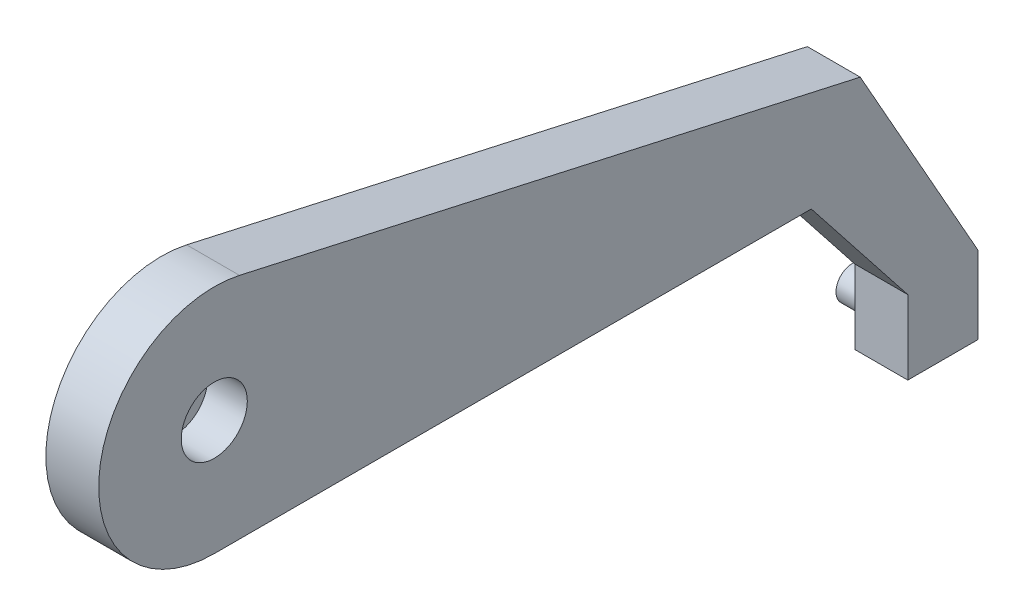
ISO-10303-21;
HEADER;
FILE_DESCRIPTION(('STEP AP214'),'2;1');
FILE_NAME('part.step','',(''),(''),'','','');
FILE_SCHEMA(('AUTOMOTIVE_DESIGN { 1 0 10303 214 1 1 1 1 }'));
ENDSEC;
DATA;
#1=APPLICATION_CONTEXT('core data for automotive mechanical design processes');
#2=APPLICATION_PROTOCOL_DEFINITION('international standard','automotive_design',2000,#1);
#3=PRODUCT_CONTEXT('',#1,'mechanical');
#4=PRODUCT('Part','Part','',(#3));
#5=PRODUCT_RELATED_PRODUCT_CATEGORY('part','',(#4));
#6=PRODUCT_DEFINITION_FORMATION('','',#4);
#7=PRODUCT_DEFINITION_CONTEXT('part definition',#1,'design');
#8=PRODUCT_DEFINITION('design','',#6,#7);
#9=PRODUCT_DEFINITION_SHAPE('','',#8);
#10=(LENGTH_UNIT() NAMED_UNIT(*) SI_UNIT(.MILLI.,.METRE.));
#11=(NAMED_UNIT(*) PLANE_ANGLE_UNIT() SI_UNIT($,.RADIAN.));
#12=(NAMED_UNIT(*) SI_UNIT($,.STERADIAN.) SOLID_ANGLE_UNIT());
#13=UNCERTAINTY_MEASURE_WITH_UNIT(LENGTH_MEASURE(1.E-05),#10,'distance_accuracy_value','');
#14=(GEOMETRIC_REPRESENTATION_CONTEXT(3) GLOBAL_UNCERTAINTY_ASSIGNED_CONTEXT((#13)) GLOBAL_UNIT_ASSIGNED_CONTEXT((#10,
#11,#12)) REPRESENTATION_CONTEXT('',''));
#15=CARTESIAN_POINT('',(0.,0.,0.));
#16=DIRECTION('',(0.,0.,1.));
#17=DIRECTION('',(1.,0.,0.));
#18=AXIS2_PLACEMENT_3D('',#15,#16,#17);
#19=CARTESIAN_POINT('',(80.,148.730177318233,-1282.73975809822));
#20=DIRECTION('',(-1.,0.,0.));
#21=DIRECTION('',(0.,0.,1.));
#22=AXIS2_PLACEMENT_3D('',#19,#20,#21);
#23=CYLINDRICAL_SURFACE('',#22,175.);
#24=CARTESIAN_POINT('',(0.,148.730177318233,-1282.73975809822));
#25=DIRECTION('',(1.,0.,0.));
#26=DIRECTION('',(0.,0.,-1.));
#27=AXIS2_PLACEMENT_3D('',#24,#25,#26);
#28=CIRCLE('',#27,175.);
#29=CARTESIAN_POINT('',(0.,319.519232733245,-1320.8986174948));
#30=VERTEX_POINT('',#29);
#31=CARTESIAN_POINT('',(0.,-26.2698226817672,-1282.73975809822));
#32=VERTEX_POINT('',#31);
#33=EDGE_CURVE('E147',#30,#32,#28,.T.);
#34=ORIENTED_EDGE('',*,*,#33,.T.);
#35=DIRECTION('',(-1.,0.,0.));
#36=VECTOR('',#35,1.);
#37=CARTESIAN_POINT('',(80.,-26.2698226817672,-1282.73975809822));
#38=LINE('',#37,#36);
#39=CARTESIAN_POINT('',(80.,-26.2698226817672,-1282.73975809822));
#40=VERTEX_POINT('',#39);
#41=EDGE_CURVE('E54',#40,#32,#38,.T.);
#42=ORIENTED_EDGE('',*,*,#41,.F.);
#43=CARTESIAN_POINT('',(80.,148.730177318233,-1282.73975809822));
#44=DIRECTION('',(1.,0.,0.));
#45=DIRECTION('',(0.,0.,-1.));
#46=AXIS2_PLACEMENT_3D('',#43,#44,#45);
#47=CIRCLE('',#46,175.);
#48=CARTESIAN_POINT('',(80.,319.519232733245,-1320.8986174948));
#49=VERTEX_POINT('',#48);
#50=EDGE_CURVE('E170',#49,#40,#47,.T.);
#51=ORIENTED_EDGE('',*,*,#50,.F.);
#52=DIRECTION('',(-1.,0.,0.));
#53=VECTOR('',#52,1.);
#54=CARTESIAN_POINT('',(80.,319.519232733245,-1320.8986174948));
#55=LINE('',#54,#53);
#56=EDGE_CURVE('E143',#49,#30,#55,.T.);
#57=ORIENTED_EDGE('',*,*,#56,.T.);
#58=EDGE_LOOP('',(#34,#42,#51,#57));
#59=FACE_BOUND('',#58,.T.);
#60=ADVANCED_FACE('F45',(#59),#23,.T.);
#61=CARTESIAN_POINT('',(80.,-26.2698226817672,-2186.53481553058));
#62=DIRECTION('',(0.,1.,0.));
#63=DIRECTION('',(0.,0.,1.));
#64=AXIS2_PLACEMENT_3D('',#61,#62,#63);
#65=PLANE('',#64);
#66=DIRECTION('',(0.,0.,-1.));
#67=VECTOR('',#66,1.);
#68=CARTESIAN_POINT('',(0.,-26.2698226817672,-2186.53481553058));
#69=LINE('',#68,#67);
#70=CARTESIAN_POINT('',(0.,-26.2698226817672,-2186.53481553058));
#71=VERTEX_POINT('',#70);
#72=EDGE_CURVE('E151',#32,#71,#69,.T.);
#73=ORIENTED_EDGE('',*,*,#72,.T.);
#74=DIRECTION('',(-1.,0.,0.));
#75=VECTOR('',#74,1.);
#76=CARTESIAN_POINT('',(80.,-26.2698226817672,-2186.53481553058));
#77=LINE('',#76,#75);
#78=CARTESIAN_POINT('',(80.,-26.2698226817672,-2186.53481553058));
#79=VERTEX_POINT('',#78);
#80=EDGE_CURVE('E185',#79,#71,#77,.T.);
#81=ORIENTED_EDGE('',*,*,#80,.F.);
#82=DIRECTION('',(0.,0.,-1.));
#83=VECTOR('',#82,1.);
#84=CARTESIAN_POINT('',(80.,-26.2698226817672,-2186.53481553058));
#85=LINE('',#84,#83);
#86=EDGE_CURVE('E106',#40,#79,#85,.T.);
#87=ORIENTED_EDGE('',*,*,#86,.F.);
#88=ORIENTED_EDGE('',*,*,#41,.T.);
#89=EDGE_LOOP('',(#73,#81,#87,#88));
#90=FACE_BOUND('',#89,.T.);
#91=ADVANCED_FACE('F190',(#90),#65,.F.);
#92=CARTESIAN_POINT('',(80.,-211.630732544569,-2332.6588914157));
#93=DIRECTION('',(0.,0.619086939164466,-0.785322457183018));
#94=DIRECTION('',(0.,0.785322457183018,0.619086939164466));
#95=AXIS2_PLACEMENT_3D('',#92,#93,#94);
#96=PLANE('',#95);
#97=DIRECTION('',(0.,-0.785322457183018,-0.619086939164466));
#98=VECTOR('',#97,1.);
#99=CARTESIAN_POINT('',(0.,-211.630732544569,-2332.6588914157));
#100=LINE('',#99,#98);
#101=CARTESIAN_POINT('',(0.,-211.630732544569,-2332.6588914157));
#102=VERTEX_POINT('',#101);
#103=EDGE_CURVE('E155',#71,#102,#100,.T.);
#104=ORIENTED_EDGE('',*,*,#103,.T.);
#105=DIRECTION('',(-1.,0.,0.));
#106=VECTOR('',#105,1.);
#107=CARTESIAN_POINT('',(80.,-211.630732544569,-2332.6588914157));
#108=LINE('',#107,#106);
#109=CARTESIAN_POINT('',(80.,-211.630732544569,-2332.6588914157));
#110=VERTEX_POINT('',#109);
#111=EDGE_CURVE('E181',#110,#102,#108,.T.);
#112=ORIENTED_EDGE('',*,*,#111,.F.);
#113=DIRECTION('',(0.,-0.785322457183018,-0.619086939164466));
#114=VECTOR('',#113,1.);
#115=CARTESIAN_POINT('',(80.,-211.630732544569,-2332.6588914157));
#116=LINE('',#115,#114);
#117=EDGE_CURVE('E209',#79,#110,#116,.T.);
#118=ORIENTED_EDGE('',*,*,#117,.F.);
#119=ORIENTED_EDGE('',*,*,#80,.T.);
#120=EDGE_LOOP('',(#104,#112,#118,#119));
#121=FACE_BOUND('',#120,.T.);
#122=ADVANCED_FACE('F201',(#121),#96,.F.);
#123=CARTESIAN_POINT('',(80.,-323.730177318233,-2332.6588914157));
#124=DIRECTION('',(0.,0.,-1.));
#125=DIRECTION('',(-1.,0.,0.));
#126=AXIS2_PLACEMENT_3D('',#123,#124,#125);
#127=PLANE('',#126);
#128=DIRECTION('',(0.,-1.,0.));
#129=VECTOR('',#128,1.);
#130=CARTESIAN_POINT('',(0.,-323.730177318233,-2332.6588914157));
#131=LINE('',#130,#129);
#132=CARTESIAN_POINT('',(0.,-323.730177318233,-2332.6588914157));
#133=VERTEX_POINT('',#132);
#134=EDGE_CURVE('E158',#102,#133,#131,.T.);
#135=ORIENTED_EDGE('',*,*,#134,.T.);
#136=DIRECTION('',(-1.,0.,0.));
#137=VECTOR('',#136,1.);
#138=CARTESIAN_POINT('',(80.,-323.730177318233,-2332.6588914157));
#139=LINE('',#138,#137);
#140=CARTESIAN_POINT('',(80.,-323.730177318233,-2332.6588914157));
#141=VERTEX_POINT('',#140);
#142=EDGE_CURVE('E177',#141,#133,#139,.T.);
#143=ORIENTED_EDGE('',*,*,#142,.F.);
#144=DIRECTION('',(0.,-1.,0.));
#145=VECTOR('',#144,1.);
#146=CARTESIAN_POINT('',(80.,-323.730177318233,-2332.6588914157));
#147=LINE('',#146,#145);
#148=EDGE_CURVE('E207',#110,#141,#147,.T.);
#149=ORIENTED_EDGE('',*,*,#148,.F.);
#150=ORIENTED_EDGE('',*,*,#111,.T.);
#151=EDGE_LOOP('',(#135,#143,#149,#150));
#152=FACE_BOUND('',#151,.T.);
#153=ADVANCED_FACE('F205',(#152),#127,.F.);
#154=CARTESIAN_POINT('',(80.,-323.730177318233,-2438.9246062279));
#155=DIRECTION('',(0.,1.,0.));
#156=DIRECTION('',(0.,0.,1.));
#157=AXIS2_PLACEMENT_3D('',#154,#155,#156);
#158=PLANE('',#157);
#159=DIRECTION('',(0.,0.,-1.));
#160=VECTOR('',#159,1.);
#161=CARTESIAN_POINT('',(0.,-323.730177318233,-2438.9246062279));
#162=LINE('',#161,#160);
#163=CARTESIAN_POINT('',(0.,-323.730177318233,-2438.9246062279));
#164=VERTEX_POINT('',#163);
#165=EDGE_CURVE('E161',#133,#164,#162,.T.);
#166=ORIENTED_EDGE('',*,*,#165,.T.);
#167=DIRECTION('',(-1.,0.,0.));
#168=VECTOR('',#167,1.);
#169=CARTESIAN_POINT('',(80.,-323.730177318233,-2438.9246062279));
#170=LINE('',#169,#168);
#171=CARTESIAN_POINT('',(80.,-323.730177318233,-2438.9246062279));
#172=VERTEX_POINT('',#171);
#173=EDGE_CURVE('E136',#172,#164,#170,.T.);
#174=ORIENTED_EDGE('',*,*,#173,.F.);
#175=DIRECTION('',(0.,0.,-1.));
#176=VECTOR('',#175,1.);
#177=CARTESIAN_POINT('',(80.,-323.730177318233,-2438.9246062279));
#178=LINE('',#177,#176);
#179=EDGE_CURVE('E125',#141,#172,#178,.T.);
#180=ORIENTED_EDGE('',*,*,#179,.F.);
#181=ORIENTED_EDGE('',*,*,#142,.T.);
#182=EDGE_LOOP('',(#166,#174,#180,#181));
#183=FACE_BOUND('',#182,.T.);
#184=ADVANCED_FACE('F265',(#183),#158,.F.);
#185=CARTESIAN_POINT('',(80.,-206.48081136748,-2438.9246062279));
#186=DIRECTION('',(0.,0.,1.));
#187=DIRECTION('',(1.,0.,0.));
#188=AXIS2_PLACEMENT_3D('',#185,#186,#187);
#189=PLANE('',#188);
#190=DIRECTION('',(0.,1.,0.));
#191=VECTOR('',#190,1.);
#192=CARTESIAN_POINT('',(0.,-206.48081136748,-2438.9246062279));
#193=LINE('',#192,#191);
#194=CARTESIAN_POINT('',(0.,-206.48081136748,-2438.9246062279));
#195=VERTEX_POINT('',#194);
#196=EDGE_CURVE('E134',#164,#195,#193,.T.);
#197=ORIENTED_EDGE('',*,*,#196,.T.);
#198=DIRECTION('',(-1.,0.,0.));
#199=VECTOR('',#198,1.);
#200=CARTESIAN_POINT('',(80.,-206.48081136748,-2438.9246062279));
#201=LINE('',#200,#199);
#202=CARTESIAN_POINT('',(80.,-206.48081136748,-2438.9246062279));
#203=VERTEX_POINT('',#202);
#204=EDGE_CURVE('E131',#203,#195,#201,.T.);
#205=ORIENTED_EDGE('',*,*,#204,.F.);
#206=DIRECTION('',(0.,1.,0.));
#207=VECTOR('',#206,1.);
#208=CARTESIAN_POINT('',(80.,-206.48081136748,-2438.9246062279));
#209=LINE('',#208,#207);
#210=EDGE_CURVE('E119',#172,#203,#209,.T.);
#211=ORIENTED_EDGE('',*,*,#210,.F.);
#212=ORIENTED_EDGE('',*,*,#173,.T.);
#213=EDGE_LOOP('',(#197,#205,#211,#212));
#214=FACE_BOUND('',#213,.T.);
#215=ADVANCED_FACE('F132',(#214),#189,.F.);
#216=CARTESIAN_POINT('',(80.,109.55856474662,-2260.62754877818));
#217=DIRECTION('',(0.,-0.491359726652531,0.870956726263682));
#218=DIRECTION('',(0.,-0.870956726263682,-0.491359726652531));
#219=AXIS2_PLACEMENT_3D('',#216,#217,#218);
#220=PLANE('',#219);
#221=DIRECTION('',(0.,0.870956726263682,0.491359726652531));
#222=VECTOR('',#221,1.);
#223=CARTESIAN_POINT('',(0.,109.55856474662,-2260.62754877818));
#224=LINE('',#223,#222);
#225=CARTESIAN_POINT('',(0.,109.55856474662,-2260.62754877818));
#226=VERTEX_POINT('',#225);
#227=EDGE_CURVE('E91',#195,#226,#224,.T.);
#228=ORIENTED_EDGE('',*,*,#227,.T.);
#229=DIRECTION('',(-1.,0.,0.));
#230=VECTOR('',#229,1.);
#231=CARTESIAN_POINT('',(80.,109.55856474662,-2260.62754877818));
#232=LINE('',#231,#230);
#233=CARTESIAN_POINT('',(80.,109.55856474662,-2260.62754877818));
#234=VERTEX_POINT('',#233);
#235=EDGE_CURVE('E137',#234,#226,#232,.T.);
#236=ORIENTED_EDGE('',*,*,#235,.F.);
#237=DIRECTION('',(0.,0.870956726263682,0.491359726652531));
#238=VECTOR('',#237,1.);
#239=CARTESIAN_POINT('',(80.,109.55856474662,-2260.62754877818));
#240=LINE('',#239,#238);
#241=EDGE_CURVE('E123',#203,#234,#240,.T.);
#242=ORIENTED_EDGE('',*,*,#241,.F.);
#243=ORIENTED_EDGE('',*,*,#204,.T.);
#244=EDGE_LOOP('',(#228,#236,#242,#243));
#245=FACE_BOUND('',#244,.T.);
#246=ADVANCED_FACE('F139',(#245),#220,.F.);
#247=CARTESIAN_POINT('',(80.,319.519232733245,-1320.8986174948));
#248=DIRECTION('',(0.,-0.975937459514354,0.218050625123315));
#249=DIRECTION('',(0.,-0.218050625123315,-0.975937459514354));
#250=AXIS2_PLACEMENT_3D('',#247,#248,#249);
#251=PLANE('',#250);
#252=DIRECTION('',(0.,0.218050625123315,0.975937459514354));
#253=VECTOR('',#252,1.);
#254=CARTESIAN_POINT('',(0.,319.519232733245,-1320.8986174948));
#255=LINE('',#254,#253);
#256=EDGE_CURVE('E97',#226,#30,#255,.T.);
#257=ORIENTED_EDGE('',*,*,#256,.T.);
#258=ORIENTED_EDGE('',*,*,#56,.F.);
#259=DIRECTION('',(0.,0.218050625123315,0.975937459514354));
#260=VECTOR('',#259,1.);
#261=CARTESIAN_POINT('',(80.,319.519232733245,-1320.8986174948));
#262=LINE('',#261,#260);
#263=EDGE_CURVE('E62',#234,#49,#262,.T.);
#264=ORIENTED_EDGE('',*,*,#263,.F.);
#265=ORIENTED_EDGE('',*,*,#235,.T.);
#266=EDGE_LOOP('',(#257,#258,#264,#265));
#267=FACE_BOUND('',#266,.T.);
#268=ADVANCED_FACE('F250',(#267),#251,.F.);
#269=CARTESIAN_POINT('',(80.,148.730177318233,-1282.73975809822));
#270=DIRECTION('',(1.,0.,0.));
#271=DIRECTION('',(0.,0.,-1.));
#272=AXIS2_PLACEMENT_3D('',#269,#270,#271);
#273=PLANE('',#272);
#274=CARTESIAN_POINT('',(80.,148.730177318233,-1282.73975809822));
#275=DIRECTION('',(1.,0.,0.));
#276=DIRECTION('',(0.,0.,-1.));
#277=AXIS2_PLACEMENT_3D('',#274,#275,#276);
#278=CIRCLE('',#277,50.);
#279=CARTESIAN_POINT('',(80.,148.730177318233,-1332.73975809822));
#280=VERTEX_POINT('',#279);
#281=EDGE_CURVE('E219',#280,#280,#278,.T.);
#282=ORIENTED_EDGE('',*,*,#281,.F.);
#283=EDGE_LOOP('',(#282));
#284=FACE_BOUND('',#283,.T.);
#285=ORIENTED_EDGE('',*,*,#50,.T.);
#286=ORIENTED_EDGE('',*,*,#86,.T.);
#287=ORIENTED_EDGE('',*,*,#117,.T.);
#288=ORIENTED_EDGE('',*,*,#148,.T.);
#289=ORIENTED_EDGE('',*,*,#179,.T.);
#290=ORIENTED_EDGE('',*,*,#210,.T.);
#291=ORIENTED_EDGE('',*,*,#241,.T.);
#292=ORIENTED_EDGE('',*,*,#263,.T.);
#293=EDGE_LOOP('',(#285,#286,#287,#288,#289,#290,#291,#292));
#294=FACE_BOUND('',#293,.T.);
#295=ADVANCED_FACE('F121',(#284,#294),#273,.T.);
#296=CARTESIAN_POINT('',(0.,148.730177318233,-1282.73975809822));
#297=DIRECTION('',(1.,0.,0.));
#298=DIRECTION('',(0.,0.,-1.));
#299=AXIS2_PLACEMENT_3D('',#296,#297,#298);
#300=PLANE('',#299);
#301=CARTESIAN_POINT('',(0.,-283.730177318233,-2378.9246062279));
#302=DIRECTION('',(1.,0.,0.));
#303=DIRECTION('',(0.,0.,-1.));
#304=AXIS2_PLACEMENT_3D('',#301,#302,#303);
#305=CIRCLE('',#304,25.);
#306=CARTESIAN_POINT('',(0.,-283.730177318233,-2403.9246062279));
#307=VERTEX_POINT('',#306);
#308=EDGE_CURVE('E11',#307,#307,#305,.F.);
#309=ORIENTED_EDGE('',*,*,#308,.F.);
#310=EDGE_LOOP('',(#309));
#311=FACE_BOUND('',#310,.T.);
#312=ORIENTED_EDGE('',*,*,#33,.F.);
#313=ORIENTED_EDGE('',*,*,#256,.F.);
#314=ORIENTED_EDGE('',*,*,#227,.F.);
#315=ORIENTED_EDGE('',*,*,#196,.F.);
#316=ORIENTED_EDGE('',*,*,#165,.F.);
#317=ORIENTED_EDGE('',*,*,#134,.F.);
#318=ORIENTED_EDGE('',*,*,#103,.F.);
#319=ORIENTED_EDGE('',*,*,#72,.F.);
#320=EDGE_LOOP('',(#312,#313,#314,#315,#316,#317,#318,#319));
#321=FACE_BOUND('',#320,.T.);
#322=ADVANCED_FACE('F195',(#311,#321),#300,.F.);
#323=CARTESIAN_POINT('',(20.,148.730177318233,-1282.73975809822));
#324=DIRECTION('',(1.,0.,0.));
#325=DIRECTION('',(0.,0.,-1.));
#326=AXIS2_PLACEMENT_3D('',#323,#324,#325);
#327=CYLINDRICAL_SURFACE('',#326,50.);
#328=CARTESIAN_POINT('',(20.,148.730177318233,-1282.73975809822));
#329=DIRECTION('',(1.,0.,0.));
#330=DIRECTION('',(0.,0.,-1.));
#331=AXIS2_PLACEMENT_3D('',#328,#329,#330);
#332=CIRCLE('',#331,50.);
#333=CARTESIAN_POINT('',(20.,148.730177318233,-1332.73975809822));
#334=VERTEX_POINT('',#333);
#335=EDGE_CURVE('E152',#334,#334,#332,.T.);
#336=CARTESIAN_POINT('',(20.,148.730177318233,-1332.73975809822));
#337=CARTESIAN_POINT('',(20.625,148.730177318233,-1332.73975809822));
#338=CARTESIAN_POINT('',(21.25,148.730177318233,-1332.73975809822));
#339=CARTESIAN_POINT('',(22.5,148.730177318233,-1332.73975809822));
#340=CARTESIAN_POINT('',(23.125,148.730177318233,-1332.73975809822));
#341=CARTESIAN_POINT('',(24.375,148.730177318233,-1332.73975809822));
#342=CARTESIAN_POINT('',(25.,148.730177318233,-1332.73975809822));
#343=CARTESIAN_POINT('',(26.25,148.730177318233,-1332.73975809822));
#344=CARTESIAN_POINT('',(26.875,148.730177318233,-1332.73975809822));
#345=CARTESIAN_POINT('',(28.125,148.730177318233,-1332.73975809822));
#346=CARTESIAN_POINT('',(28.75,148.730177318233,-1332.73975809822));
#347=CARTESIAN_POINT('',(30.,148.730177318233,-1332.73975809822));
#348=CARTESIAN_POINT('',(30.625,148.730177318233,-1332.73975809822));
#349=CARTESIAN_POINT('',(31.875,148.730177318233,-1332.73975809822));
#350=CARTESIAN_POINT('',(32.5,148.730177318233,-1332.73975809822));
#351=CARTESIAN_POINT('',(33.75,148.730177318233,-1332.73975809822));
#352=CARTESIAN_POINT('',(34.375,148.730177318233,-1332.73975809822));
#353=CARTESIAN_POINT('',(35.625,148.730177318233,-1332.73975809822));
#354=CARTESIAN_POINT('',(36.25,148.730177318233,-1332.73975809822));
#355=CARTESIAN_POINT('',(37.5,148.730177318233,-1332.73975809822));
#356=CARTESIAN_POINT('',(38.125,148.730177318233,-1332.73975809822));
#357=CARTESIAN_POINT('',(39.375,148.730177318233,-1332.73975809822));
#358=CARTESIAN_POINT('',(40.,148.730177318233,-1332.73975809822));
#359=CARTESIAN_POINT('',(41.25,148.730177318233,-1332.73975809822));
#360=CARTESIAN_POINT('',(41.875,148.730177318233,-1332.73975809822));
#361=CARTESIAN_POINT('',(43.125,148.730177318233,-1332.73975809822));
#362=CARTESIAN_POINT('',(43.75,148.730177318233,-1332.73975809822));
#363=CARTESIAN_POINT('',(45.,148.730177318233,-1332.73975809822));
#364=CARTESIAN_POINT('',(45.625,148.730177318233,-1332.73975809822));
#365=CARTESIAN_POINT('',(46.875,148.730177318233,-1332.73975809822));
#366=CARTESIAN_POINT('',(47.5,148.730177318233,-1332.73975809822));
#367=CARTESIAN_POINT('',(48.75,148.730177318233,-1332.73975809822));
#368=CARTESIAN_POINT('',(49.375,148.730177318233,-1332.73975809822));
#369=CARTESIAN_POINT('',(50.625,148.730177318233,-1332.73975809822));
#370=CARTESIAN_POINT('',(51.25,148.730177318233,-1332.73975809822));
#371=CARTESIAN_POINT('',(52.5,148.730177318233,-1332.73975809822));
#372=CARTESIAN_POINT('',(53.125,148.730177318233,-1332.73975809822));
#373=CARTESIAN_POINT('',(54.375,148.730177318233,-1332.73975809822));
#374=CARTESIAN_POINT('',(55.,148.730177318233,-1332.73975809822));
#375=CARTESIAN_POINT('',(56.25,148.730177318233,-1332.73975809822));
#376=CARTESIAN_POINT('',(56.875,148.730177318233,-1332.73975809822));
#377=CARTESIAN_POINT('',(58.125,148.730177318233,-1332.73975809822));
#378=CARTESIAN_POINT('',(58.75,148.730177318233,-1332.73975809822));
#379=CARTESIAN_POINT('',(60.,148.730177318233,-1332.73975809822));
#380=CARTESIAN_POINT('',(60.625,148.730177318233,-1332.73975809822));
#381=CARTESIAN_POINT('',(61.875,148.730177318233,-1332.73975809822));
#382=CARTESIAN_POINT('',(62.5,148.730177318233,-1332.73975809822));
#383=CARTESIAN_POINT('',(63.75,148.730177318233,-1332.73975809822));
#384=CARTESIAN_POINT('',(64.375,148.730177318233,-1332.73975809822));
#385=CARTESIAN_POINT('',(65.625,148.730177318233,-1332.73975809822));
#386=CARTESIAN_POINT('',(66.25,148.730177318233,-1332.73975809822));
#387=CARTESIAN_POINT('',(67.5,148.730177318233,-1332.73975809822));
#388=CARTESIAN_POINT('',(68.125,148.730177318233,-1332.73975809822));
#389=CARTESIAN_POINT('',(69.375,148.730177318233,-1332.73975809822));
#390=CARTESIAN_POINT('',(70.,148.730177318233,-1332.73975809822));
#391=CARTESIAN_POINT('',(71.25,148.730177318233,-1332.73975809822));
#392=CARTESIAN_POINT('',(71.875,148.730177318233,-1332.73975809822));
#393=CARTESIAN_POINT('',(73.125,148.730177318233,-1332.73975809822));
#394=CARTESIAN_POINT('',(73.75,148.730177318233,-1332.73975809822));
#395=CARTESIAN_POINT('',(75.,148.730177318233,-1332.73975809822));
#396=CARTESIAN_POINT('',(75.625,148.730177318233,-1332.73975809822));
#397=CARTESIAN_POINT('',(76.875,148.730177318233,-1332.73975809822));
#398=CARTESIAN_POINT('',(77.5,148.730177318233,-1332.73975809822));
#399=CARTESIAN_POINT('',(78.75,148.730177318233,-1332.73975809822));
#400=CARTESIAN_POINT('',(79.375,148.730177318233,-1332.73975809822));
#401=CARTESIAN_POINT('',(80.,148.730177318233,-1332.73975809822));
#402=B_SPLINE_CURVE_WITH_KNOTS('',3,(#336,#337,#338,#339,#340,#341,#342,#343,#344,#345,#346,
#347,#348,#349,#350,#351,#352,#353,#354,#355,#356,#357,#358,#359,#360,#361,#362,#363,#364,#365,
#366,#367,#368,#369,#370,#371,#372,#373,#374,#375,#376,#377,#378,#379,#380,#381,#382,#383,#384,
#385,#386,#387,#388,#389,#390,#391,#392,#393,#394,#395,#396,#397,#398,#399,#400,#401),
.UNSPECIFIED.,.F.,.F.,(4,2,2,2,2,2,2,2,2,2,2,2,2,2,2,2,2,2,2,2,2,2,2,2,2,2,2,2,2,2,2,2,4),(0.,
1.875,3.75,5.625,7.5,9.375,11.25,13.125,15.,16.875,18.75,20.625,22.5,24.375,26.25,28.125,30.,
31.875,33.75,35.625,37.5,39.375,41.25,43.125,45.,46.875,48.75,50.625,52.5,54.375,56.25,58.125,
60.),.UNSPECIFIED.);
#403=EDGE_CURVE('BSEAM241',#334,#280,#402,.T.);
#404=ORIENTED_EDGE('',*,*,#335,.F.);
#405=ORIENTED_EDGE('',*,*,#281,.T.);
#406=ORIENTED_EDGE('',*,*,#403,.T.);
#407=ORIENTED_EDGE('',*,*,#403,.F.);
#408=EDGE_LOOP('',(#404,#406,#405,#407));
#409=FACE_BOUND('',#408,.T.);
#410=ADVANCED_FACE('F241',(#409),#327,.F.);
#411=CARTESIAN_POINT('',(20.,148.730177318233,-1282.73975809822));
#412=DIRECTION('',(1.,0.,0.));
#413=DIRECTION('',(0.,0.,-1.));
#414=AXIS2_PLACEMENT_3D('',#411,#412,#413);
#415=PLANE('',#414);
#416=ORIENTED_EDGE('',*,*,#335,.T.);
#417=EDGE_LOOP('',(#416));
#418=FACE_BOUND('',#417,.T.);
#419=ADVANCED_FACE('F236',(#418),#415,.T.);
#420=CARTESIAN_POINT('',(-50.,-283.730177318233,-2378.9246062279));
#421=DIRECTION('',(1.,0.,0.));
#422=DIRECTION('',(0.,0.,-1.));
#423=AXIS2_PLACEMENT_3D('',#420,#421,#422);
#424=CYLINDRICAL_SURFACE('',#423,25.);
#425=CARTESIAN_POINT('',(-50.,-283.730177318233,-2378.9246062279));
#426=DIRECTION('',(-1.,0.,0.));
#427=DIRECTION('',(0.,0.,1.));
#428=AXIS2_PLACEMENT_3D('',#425,#426,#427);
#429=CIRCLE('',#428,25.);
#430=CARTESIAN_POINT('',(-50.,-283.730177318233,-2353.9246062279));
#431=VERTEX_POINT('',#430);
#432=EDGE_CURVE('E223',#431,#431,#429,.T.);
#433=ORIENTED_EDGE('',*,*,#432,.F.);
#434=EDGE_LOOP('',(#433));
#435=FACE_BOUND('',#434,.T.);
#436=ORIENTED_EDGE('',*,*,#308,.T.);
#437=EDGE_LOOP('',(#436));
#438=FACE_BOUND('',#437,.T.);
#439=ADVANCED_FACE('F233',(#435,#438),#424,.T.);
#440=CARTESIAN_POINT('',(-50.,-283.730177318233,-2378.9246062279));
#441=DIRECTION('',(-1.,0.,0.));
#442=DIRECTION('',(0.,0.,1.));
#443=AXIS2_PLACEMENT_3D('',#440,#441,#442);
#444=PLANE('',#443);
#445=ORIENTED_EDGE('',*,*,#432,.T.);
#446=EDGE_LOOP('',(#445));
#447=FACE_BOUND('',#446,.T.);
#448=ADVANCED_FACE('F231',(#447),#444,.T.);
#449=CLOSED_SHELL('',(#60,#91,#122,#153,#184,#215,#246,#268,#295,#322,#410,#419,#439,#448));
#450=MANIFOLD_SOLID_BREP('B2',#449);
#451=ADVANCED_BREP_SHAPE_REPRESENTATION('',(#18,#450),#14);
#452=SHAPE_DEFINITION_REPRESENTATION(#9,#451);
ENDSEC;
END-ISO-10303-21;
